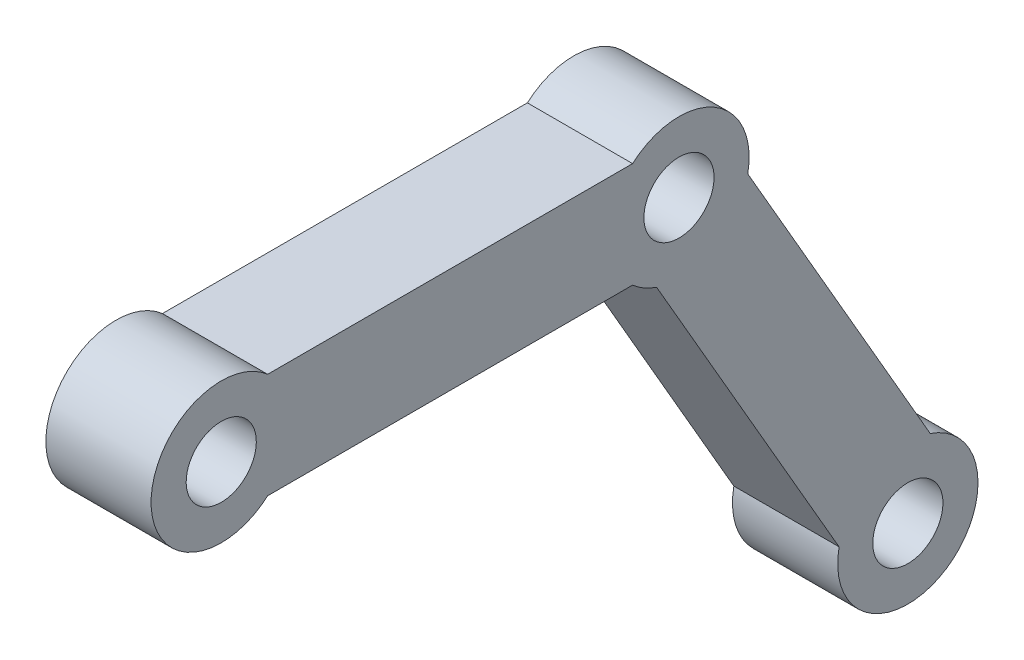
ISO-10303-21;
HEADER;
FILE_DESCRIPTION(('STEP AP214'),'2;1');
FILE_NAME('part.step','',(''),(''),'','','');
FILE_SCHEMA(('AUTOMOTIVE_DESIGN { 1 0 10303 214 1 1 1 1 }'));
ENDSEC;
DATA;
#1=APPLICATION_CONTEXT('core data for automotive mechanical design processes');
#2=APPLICATION_PROTOCOL_DEFINITION('international standard','automotive_design',2000,#1);
#3=PRODUCT_CONTEXT('',#1,'mechanical');
#4=PRODUCT('Part','Part','',(#3));
#5=PRODUCT_RELATED_PRODUCT_CATEGORY('part','',(#4));
#6=PRODUCT_DEFINITION_FORMATION('','',#4);
#7=PRODUCT_DEFINITION_CONTEXT('part definition',#1,'design');
#8=PRODUCT_DEFINITION('design','',#6,#7);
#9=PRODUCT_DEFINITION_SHAPE('','',#8);
#10=(LENGTH_UNIT() NAMED_UNIT(*) SI_UNIT(.MILLI.,.METRE.));
#11=(NAMED_UNIT(*) PLANE_ANGLE_UNIT() SI_UNIT($,.RADIAN.));
#12=(NAMED_UNIT(*) SI_UNIT($,.STERADIAN.) SOLID_ANGLE_UNIT());
#13=UNCERTAINTY_MEASURE_WITH_UNIT(LENGTH_MEASURE(1.E-05),#10,'distance_accuracy_value','');
#14=(GEOMETRIC_REPRESENTATION_CONTEXT(3) GLOBAL_UNCERTAINTY_ASSIGNED_CONTEXT((#13)) GLOBAL_UNIT_ASSIGNED_CONTEXT((#10,
#11,#12)) REPRESENTATION_CONTEXT('',''));
#15=CARTESIAN_POINT('',(0.,0.,0.));
#16=DIRECTION('',(0.,0.,1.));
#17=DIRECTION('',(1.,0.,0.));
#18=AXIS2_PLACEMENT_3D('',#15,#16,#17);
#19=CARTESIAN_POINT('',(-15.,0.836602540378303,17.803520777581));
#20=DIRECTION('',(0.,0.500000000000004,-0.866025403784436));
#21=DIRECTION('',(0.,0.866025403784436,0.500000000000004));
#22=AXIS2_PLACEMENT_3D('',#19,#20,#21);
#23=PLANE('',#22);
#24=DIRECTION('',(0.,-0.866025403784436,-0.500000000000004));
#25=VECTOR('',#24,1.);
#26=CARTESIAN_POINT('',(-15.,0.836602540378303,17.803520777581));
#27=LINE('',#26,#25);
#28=CARTESIAN_POINT('',(-15.,-18.9564392373896,6.37600277910501));
#29=VERTEX_POINT('',#28);
#30=CARTESIAN_POINT('',(-15.,-109.059875956479,-45.6452406655725));
#31=VERTEX_POINT('',#30);
#32=EDGE_CURVE('E227',#29,#31,#27,.T.);
#33=ORIENTED_EDGE('',*,*,#32,.T.);
#34=DIRECTION('',(1.,0.,0.));
#35=VECTOR('',#34,1.);
#36=CARTESIAN_POINT('',(-15.,-109.059875956479,-45.6452406655725));
#37=LINE('',#36,#35);
#38=CARTESIAN_POINT('',(15.,-109.059875956479,-45.6452406655725));
#39=VERTEX_POINT('',#38);
#40=EDGE_CURVE('E313',#31,#39,#37,.T.);
#41=ORIENTED_EDGE('',*,*,#40,.T.);
#42=DIRECTION('',(0.,-0.866025403784436,-0.500000000000004));
#43=VECTOR('',#42,1.);
#44=CARTESIAN_POINT('',(15.,0.836602540378303,17.803520777581));
#45=LINE('',#44,#43);
#46=CARTESIAN_POINT('',(15.,-18.9564392373896,6.37600277910501));
#47=VERTEX_POINT('',#46);
#48=EDGE_CURVE('E223',#47,#39,#45,.T.);
#49=ORIENTED_EDGE('',*,*,#48,.F.);
#50=DIRECTION('',(1.,0.,0.));
#51=VECTOR('',#50,1.);
#52=CARTESIAN_POINT('',(-15.,-18.9564392373896,6.37600277910501));
#53=LINE('',#52,#51);
#54=EDGE_CURVE('E187',#47,#29,#53,.F.);
#55=ORIENTED_EDGE('',*,*,#54,.T.);
#56=EDGE_LOOP('',(#33,#41,#49,#55));
#57=FACE_BOUND('',#56,.T.);
#58=ADVANCED_FACE('F40',(#57),#23,.F.);
#59=CARTESIAN_POINT('',(-15.,15.8366025403784,-8.17724133595211));
#60=DIRECTION('',(0.,-0.500000000000004,0.866025403784436));
#61=DIRECTION('',(0.,-0.866025403784436,-0.500000000000004));
#62=AXIS2_PLACEMENT_3D('',#59,#60,#61);
#63=PLANE('',#62);
#64=DIRECTION('',(0.,-0.866025403784436,-0.500000000000004));
#65=VECTOR('',#64,1.);
#66=CARTESIAN_POINT('',(15.,15.8366025403784,-8.17724133595211));
#67=LINE('',#66,#65);
#68=CARTESIAN_POINT('',(15.,-3.95643923738951,-19.6047593344281));
#69=VERTEX_POINT('',#68);
#70=CARTESIAN_POINT('',(15.,-94.0598759564793,-71.6260027791056));
#71=VERTEX_POINT('',#70);
#72=EDGE_CURVE('E219',#69,#71,#67,.T.);
#73=ORIENTED_EDGE('',*,*,#72,.T.);
#74=DIRECTION('',(1.,0.,0.));
#75=VECTOR('',#74,1.);
#76=CARTESIAN_POINT('',(-15.,-94.0598759564793,-71.6260027791056));
#77=LINE('',#76,#75);
#78=CARTESIAN_POINT('',(-15.,-94.0598759564793,-71.6260027791056));
#79=VERTEX_POINT('',#78);
#80=EDGE_CURVE('E310',#71,#79,#77,.F.);
#81=ORIENTED_EDGE('',*,*,#80,.T.);
#82=DIRECTION('',(0.,-0.866025403784436,-0.500000000000004));
#83=VECTOR('',#82,1.);
#84=CARTESIAN_POINT('',(-15.,15.8366025403784,-8.17724133595211));
#85=LINE('',#84,#83);
#86=CARTESIAN_POINT('',(-15.,-3.95643923738951,-19.6047593344281));
#87=VERTEX_POINT('',#86);
#88=EDGE_CURVE('E214',#87,#79,#85,.T.);
#89=ORIENTED_EDGE('',*,*,#88,.F.);
#90=DIRECTION('',(1.,0.,0.));
#91=VECTOR('',#90,1.);
#92=CARTESIAN_POINT('',(-15.,-3.9564392373895,-19.6047593344281));
#93=LINE('',#92,#91);
#94=EDGE_CURVE('E267',#87,#69,#93,.T.);
#95=ORIENTED_EDGE('',*,*,#94,.T.);
#96=EDGE_LOOP('',(#73,#81,#89,#95));
#97=FACE_BOUND('',#96,.T.);
#98=ADVANCED_FACE('F42',(#97),#63,.F.);
#99=CARTESIAN_POINT('',(-15.,15.,130.5));
#100=DIRECTION('',(0.,-1.,0.));
#101=DIRECTION('',(0.,0.,-1.));
#102=AXIS2_PLACEMENT_3D('',#99,#100,#101);
#103=PLANE('',#102);
#104=DIRECTION('',(0.,0.,-1.));
#105=VECTOR('',#104,1.);
#106=CARTESIAN_POINT('',(-15.,15.,130.5));
#107=LINE('',#106,#105);
#108=CARTESIAN_POINT('',(-15.,15.,117.271243444677));
#109=VERTEX_POINT('',#108);
#110=CARTESIAN_POINT('',(-15.,15.,13.228756555323));
#111=VERTEX_POINT('',#110);
#112=EDGE_CURVE('E211',#109,#111,#107,.T.);
#113=ORIENTED_EDGE('',*,*,#112,.F.);
#114=DIRECTION('',(1.,0.,0.));
#115=VECTOR('',#114,1.);
#116=CARTESIAN_POINT('',(-15.,15.,117.271243444677));
#117=LINE('',#116,#115);
#118=CARTESIAN_POINT('',(15.,15.,117.271243444677));
#119=VERTEX_POINT('',#118);
#120=EDGE_CURVE('E57',#109,#119,#117,.T.);
#121=ORIENTED_EDGE('',*,*,#120,.T.);
#122=DIRECTION('',(0.,0.,-1.));
#123=VECTOR('',#122,1.);
#124=CARTESIAN_POINT('',(15.,15.,130.5));
#125=LINE('',#124,#123);
#126=CARTESIAN_POINT('',(15.,15.,13.228756555323));
#127=VERTEX_POINT('',#126);
#128=EDGE_CURVE('E197',#119,#127,#125,.T.);
#129=ORIENTED_EDGE('',*,*,#128,.T.);
#130=DIRECTION('',(1.,0.,0.));
#131=VECTOR('',#130,1.);
#132=CARTESIAN_POINT('',(-15.,15.,13.228756555323));
#133=LINE('',#132,#131);
#134=EDGE_CURVE('E259',#127,#111,#133,.F.);
#135=ORIENTED_EDGE('',*,*,#134,.T.);
#136=EDGE_LOOP('',(#113,#121,#129,#135));
#137=FACE_BOUND('',#136,.T.);
#138=ADVANCED_FACE('F394',(#137),#103,.F.);
#139=CARTESIAN_POINT('',(15.,15.,130.5));
#140=DIRECTION('',(-1.,0.,0.));
#141=DIRECTION('',(0.,-1.,0.));
#142=AXIS2_PLACEMENT_3D('',#139,#140,#141);
#143=PLANE('',#142);
#144=CARTESIAN_POINT('',(15.,0.,130.5));
#145=DIRECTION('',(1.,0.,0.));
#146=DIRECTION('',(0.,1.,0.));
#147=AXIS2_PLACEMENT_3D('',#144,#145,#146);
#148=CIRCLE('',#147,9.99999999999999);
#149=CARTESIAN_POINT('',(15.,10.,130.5));
#150=VERTEX_POINT('',#149);
#151=EDGE_CURVE('E418',#150,#150,#148,.T.);
#152=ORIENTED_EDGE('',*,*,#151,.F.);
#153=EDGE_LOOP('',(#152));
#154=FACE_BOUND('',#153,.T.);
#155=CARTESIAN_POINT('',(15.,0.,0.));
#156=DIRECTION('',(1.,0.,0.));
#157=DIRECTION('',(0.,1.,0.));
#158=AXIS2_PLACEMENT_3D('',#155,#156,#157);
#159=CIRCLE('',#158,10.);
#160=CARTESIAN_POINT('',(15.,10.,0.));
#161=VERTEX_POINT('',#160);
#162=EDGE_CURVE('E631',#161,#161,#159,.T.);
#163=ORIENTED_EDGE('',*,*,#162,.F.);
#164=EDGE_LOOP('',(#163));
#165=FACE_BOUND('',#164,.T.);
#166=CARTESIAN_POINT('',(15.,-113.016315193869,-65.2500000000006));
#167=DIRECTION('',(1.,0.,0.));
#168=DIRECTION('',(0.,1.,0.));
#169=AXIS2_PLACEMENT_3D('',#166,#167,#168);
#170=CIRCLE('',#169,9.99999999999999);
#171=CARTESIAN_POINT('',(15.,-103.016315193869,-65.2500000000006));
#172=VERTEX_POINT('',#171);
#173=EDGE_CURVE('E640',#172,#172,#170,.T.);
#174=ORIENTED_EDGE('',*,*,#173,.F.);
#175=EDGE_LOOP('',(#174));
#176=FACE_BOUND('',#175,.T.);
#177=ORIENTED_EDGE('',*,*,#128,.F.);
#178=CARTESIAN_POINT('',(15.,0.,130.5));
#179=DIRECTION('',(1.,0.,0.));
#180=DIRECTION('',(0.,1.,0.));
#181=AXIS2_PLACEMENT_3D('',#178,#179,#180);
#182=CIRCLE('',#181,20.);
#183=CARTESIAN_POINT('',(15.,-15.,117.271243444677));
#184=VERTEX_POINT('',#183);
#185=EDGE_CURVE('E408',#119,#184,#182,.T.);
#186=ORIENTED_EDGE('',*,*,#185,.T.);
#187=DIRECTION('',(0.,0.,-1.));
#188=VECTOR('',#187,1.);
#189=CARTESIAN_POINT('',(15.,-15.,130.5));
#190=LINE('',#189,#188);
#191=CARTESIAN_POINT('',(15.,-15.,13.2287565553229));
#192=VERTEX_POINT('',#191);
#193=EDGE_CURVE('E65',#184,#192,#190,.T.);
#194=ORIENTED_EDGE('',*,*,#193,.T.);
#195=CARTESIAN_POINT('',(15.,0.,0.));
#196=DIRECTION('',(1.,0.,0.));
#197=DIRECTION('',(0.,1.,0.));
#198=AXIS2_PLACEMENT_3D('',#195,#196,#197);
#199=CIRCLE('',#198,20.);
#200=EDGE_CURVE('E321',#192,#47,#199,.T.);
#201=ORIENTED_EDGE('',*,*,#200,.T.);
#202=ORIENTED_EDGE('',*,*,#48,.T.);
#203=CARTESIAN_POINT('',(15.,-113.016315193869,-65.2500000000006));
#204=DIRECTION('',(1.,0.,0.));
#205=DIRECTION('',(0.,1.,0.));
#206=AXIS2_PLACEMENT_3D('',#203,#204,#205);
#207=CIRCLE('',#206,20.);
#208=EDGE_CURVE('E294',#39,#71,#207,.T.);
#209=ORIENTED_EDGE('',*,*,#208,.T.);
#210=ORIENTED_EDGE('',*,*,#72,.F.);
#211=EDGE_CURVE('E316',#69,#127,#199,.T.);
#212=ORIENTED_EDGE('',*,*,#211,.T.);
#213=EDGE_LOOP('',(#177,#186,#194,#201,#202,#209,#210,#212));
#214=FACE_BOUND('',#213,.T.);
#215=ADVANCED_FACE('F386',(#154,#165,#176,#214),#143,.F.);
#216=CARTESIAN_POINT('',(-15.,-15.,130.5));
#217=DIRECTION('',(0.,1.,0.));
#218=DIRECTION('',(0.,0.,1.));
#219=AXIS2_PLACEMENT_3D('',#216,#217,#218);
#220=PLANE('',#219);
#221=ORIENTED_EDGE('',*,*,#193,.F.);
#222=DIRECTION('',(1.,0.,0.));
#223=VECTOR('',#222,1.);
#224=CARTESIAN_POINT('',(-15.,-15.,117.271243444677));
#225=LINE('',#224,#223);
#226=CARTESIAN_POINT('',(-15.,-15.,117.271243444677));
#227=VERTEX_POINT('',#226);
#228=EDGE_CURVE('E411',#184,#227,#225,.F.);
#229=ORIENTED_EDGE('',*,*,#228,.T.);
#230=DIRECTION('',(0.,0.,-1.));
#231=VECTOR('',#230,1.);
#232=CARTESIAN_POINT('',(-15.,-15.,130.5));
#233=LINE('',#232,#231);
#234=CARTESIAN_POINT('',(-15.,-15.,13.228756555323));
#235=VERTEX_POINT('',#234);
#236=EDGE_CURVE('E208',#227,#235,#233,.T.);
#237=ORIENTED_EDGE('',*,*,#236,.T.);
#238=DIRECTION('',(1.,0.,0.));
#239=VECTOR('',#238,1.);
#240=CARTESIAN_POINT('',(-15.,-15.,13.228756555323));
#241=LINE('',#240,#239);
#242=EDGE_CURVE('E254',#235,#192,#241,.T.);
#243=ORIENTED_EDGE('',*,*,#242,.T.);
#244=EDGE_LOOP('',(#221,#229,#237,#243));
#245=FACE_BOUND('',#244,.T.);
#246=ADVANCED_FACE('F380',(#245),#220,.F.);
#247=CARTESIAN_POINT('',(-15.,15.,130.5));
#248=DIRECTION('',(1.,0.,0.));
#249=DIRECTION('',(0.,1.,0.));
#250=AXIS2_PLACEMENT_3D('',#247,#248,#249);
#251=PLANE('',#250);
#252=CARTESIAN_POINT('',(-15.,0.,130.5));
#253=DIRECTION('',(1.,0.,0.));
#254=DIRECTION('',(0.,1.,0.));
#255=AXIS2_PLACEMENT_3D('',#252,#253,#254);
#256=CIRCLE('',#255,9.99999999999999);
#257=CARTESIAN_POINT('',(-15.,9.99999999999999,130.5));
#258=VERTEX_POINT('',#257);
#259=EDGE_CURVE('E413',#258,#258,#256,.T.);
#260=ORIENTED_EDGE('',*,*,#259,.T.);
#261=EDGE_LOOP('',(#260));
#262=FACE_BOUND('',#261,.T.);
#263=CARTESIAN_POINT('',(-15.,0.,0.));
#264=DIRECTION('',(1.,0.,0.));
#265=DIRECTION('',(0.,1.,0.));
#266=AXIS2_PLACEMENT_3D('',#263,#264,#265);
#267=CIRCLE('',#266,10.);
#268=CARTESIAN_POINT('',(-15.,10.,0.));
#269=VERTEX_POINT('',#268);
#270=EDGE_CURVE('E627',#269,#269,#267,.T.);
#271=ORIENTED_EDGE('',*,*,#270,.T.);
#272=EDGE_LOOP('',(#271));
#273=FACE_BOUND('',#272,.T.);
#274=CARTESIAN_POINT('',(-15.,-113.016315193869,-65.2500000000006));
#275=DIRECTION('',(1.,0.,0.));
#276=DIRECTION('',(0.,1.,0.));
#277=AXIS2_PLACEMENT_3D('',#274,#275,#276);
#278=CIRCLE('',#277,9.99999999999999);
#279=CARTESIAN_POINT('',(-15.,-103.016315193869,-65.2500000000006));
#280=VERTEX_POINT('',#279);
#281=EDGE_CURVE('E637',#280,#280,#278,.T.);
#282=ORIENTED_EDGE('',*,*,#281,.T.);
#283=EDGE_LOOP('',(#282));
#284=FACE_BOUND('',#283,.T.);
#285=CARTESIAN_POINT('',(-15.,0.,130.5));
#286=DIRECTION('',(1.,0.,0.));
#287=DIRECTION('',(0.,1.,0.));
#288=AXIS2_PLACEMENT_3D('',#285,#286,#287);
#289=CIRCLE('',#288,20.);
#290=EDGE_CURVE('E171',#109,#227,#289,.T.);
#291=ORIENTED_EDGE('',*,*,#290,.F.);
#292=ORIENTED_EDGE('',*,*,#112,.T.);
#293=CARTESIAN_POINT('',(-15.,0.,0.));
#294=DIRECTION('',(1.,0.,0.));
#295=DIRECTION('',(0.,1.,0.));
#296=AXIS2_PLACEMENT_3D('',#293,#294,#295);
#297=CIRCLE('',#296,20.);
#298=EDGE_CURVE('E317',#87,#111,#297,.T.);
#299=ORIENTED_EDGE('',*,*,#298,.F.);
#300=ORIENTED_EDGE('',*,*,#88,.T.);
#301=CARTESIAN_POINT('',(-15.,-113.016315193869,-65.2500000000006));
#302=DIRECTION('',(1.,0.,0.));
#303=DIRECTION('',(0.,1.,0.));
#304=AXIS2_PLACEMENT_3D('',#301,#302,#303);
#305=CIRCLE('',#304,20.);
#306=EDGE_CURVE('E288',#31,#79,#305,.T.);
#307=ORIENTED_EDGE('',*,*,#306,.F.);
#308=ORIENTED_EDGE('',*,*,#32,.F.);
#309=EDGE_CURVE('E287',#235,#29,#297,.T.);
#310=ORIENTED_EDGE('',*,*,#309,.F.);
#311=ORIENTED_EDGE('',*,*,#236,.F.);
#312=EDGE_LOOP('',(#291,#292,#299,#300,#307,#308,#310,#311));
#313=FACE_BOUND('',#312,.T.);
#314=ADVANCED_FACE('F285',(#262,#273,#284,#313),#251,.F.);
#315=CARTESIAN_POINT('',(-15.,0.,0.));
#316=DIRECTION('',(1.,0.,0.));
#317=DIRECTION('',(0.,1.,0.));
#318=AXIS2_PLACEMENT_3D('',#315,#316,#317);
#319=CYLINDRICAL_SURFACE('',#318,20.);
#320=ORIENTED_EDGE('',*,*,#54,.F.);
#321=ORIENTED_EDGE('',*,*,#200,.F.);
#322=ORIENTED_EDGE('',*,*,#242,.F.);
#323=ORIENTED_EDGE('',*,*,#309,.T.);
#324=EDGE_LOOP('',(#320,#321,#322,#323));
#325=FACE_BOUND('',#324,.T.);
#326=ADVANCED_FACE('F369',(#325),#319,.T.);
#327=ORIENTED_EDGE('',*,*,#94,.F.);
#328=ORIENTED_EDGE('',*,*,#298,.T.);
#329=ORIENTED_EDGE('',*,*,#134,.F.);
#330=ORIENTED_EDGE('',*,*,#211,.F.);
#331=EDGE_LOOP('',(#327,#328,#329,#330));
#332=FACE_BOUND('',#331,.T.);
#333=ADVANCED_FACE('F360',(#332),#319,.T.);
#334=CARTESIAN_POINT('',(-15.,-113.016315193869,-65.2500000000006));
#335=DIRECTION('',(1.,0.,0.));
#336=DIRECTION('',(0.,1.,0.));
#337=AXIS2_PLACEMENT_3D('',#334,#335,#336);
#338=CYLINDRICAL_SURFACE('',#337,20.);
#339=ORIENTED_EDGE('',*,*,#40,.F.);
#340=ORIENTED_EDGE('',*,*,#306,.T.);
#341=ORIENTED_EDGE('',*,*,#80,.F.);
#342=ORIENTED_EDGE('',*,*,#208,.F.);
#343=EDGE_LOOP('',(#339,#340,#341,#342));
#344=FACE_BOUND('',#343,.T.);
#345=ADVANCED_FACE('F349',(#344),#338,.T.);
#346=CARTESIAN_POINT('',(-15.,0.,130.5));
#347=DIRECTION('',(1.,0.,0.));
#348=DIRECTION('',(0.,1.,0.));
#349=AXIS2_PLACEMENT_3D('',#346,#347,#348);
#350=CYLINDRICAL_SURFACE('',#349,20.);
#351=ORIENTED_EDGE('',*,*,#120,.F.);
#352=ORIENTED_EDGE('',*,*,#290,.T.);
#353=ORIENTED_EDGE('',*,*,#228,.F.);
#354=ORIENTED_EDGE('',*,*,#185,.F.);
#355=EDGE_LOOP('',(#351,#352,#353,#354));
#356=FACE_BOUND('',#355,.T.);
#357=ADVANCED_FACE('F359',(#356),#350,.T.);
#358=CARTESIAN_POINT('',(-15.,-113.016315193869,-65.2500000000006));
#359=DIRECTION('',(1.,0.,0.));
#360=DIRECTION('',(0.,1.,0.));
#361=AXIS2_PLACEMENT_3D('',#358,#359,#360);
#362=CYLINDRICAL_SURFACE('',#361,9.99999999999999);
#363=ORIENTED_EDGE('',*,*,#281,.F.);
#364=EDGE_LOOP('',(#363));
#365=FACE_BOUND('',#364,.T.);
#366=ORIENTED_EDGE('',*,*,#173,.T.);
#367=EDGE_LOOP('',(#366));
#368=FACE_BOUND('',#367,.T.);
#369=ADVANCED_FACE('F486',(#365,#368),#362,.F.);
#370=CARTESIAN_POINT('',(-15.,0.,0.));
#371=DIRECTION('',(1.,0.,0.));
#372=DIRECTION('',(0.,1.,0.));
#373=AXIS2_PLACEMENT_3D('',#370,#371,#372);
#374=CYLINDRICAL_SURFACE('',#373,10.);
#375=ORIENTED_EDGE('',*,*,#270,.F.);
#376=EDGE_LOOP('',(#375));
#377=FACE_BOUND('',#376,.T.);
#378=ORIENTED_EDGE('',*,*,#162,.T.);
#379=EDGE_LOOP('',(#378));
#380=FACE_BOUND('',#379,.T.);
#381=ADVANCED_FACE('F490',(#377,#380),#374,.F.);
#382=CARTESIAN_POINT('',(-15.,0.,130.5));
#383=DIRECTION('',(1.,0.,0.));
#384=DIRECTION('',(0.,1.,0.));
#385=AXIS2_PLACEMENT_3D('',#382,#383,#384);
#386=CYLINDRICAL_SURFACE('',#385,9.99999999999999);
#387=ORIENTED_EDGE('',*,*,#259,.F.);
#388=EDGE_LOOP('',(#387));
#389=FACE_BOUND('',#388,.T.);
#390=ORIENTED_EDGE('',*,*,#151,.T.);
#391=EDGE_LOOP('',(#390));
#392=FACE_BOUND('',#391,.T.);
#393=ADVANCED_FACE('F501',(#389,#392),#386,.F.);
#394=CLOSED_SHELL('',(#58,#98,#138,#215,#246,#314,#326,#333,#345,#357,#369,#381,#393));
#395=DIRECTION('',(1.,0.,0.));
#396=VECTOR('',#395,1.);
#397=CARTESIAN_POINT('',(-15.,12.5,15.612494995996));
#398=LINE('',#397,#396);
#399=CARTESIAN_POINT('',(-12.5,12.5,15.612494995996));
#400=VERTEX_POINT('',#399);
#401=CARTESIAN_POINT('',(12.5,12.5,15.612494995996));
#402=VERTEX_POINT('',#401);
#403=EDGE_CURVE('E332',#400,#402,#398,.T.);
#404=ORIENTED_EDGE('',*,*,#403,.F.);
#405=CARTESIAN_POINT('',(-12.5,0.,0.));
#406=DIRECTION('',(-1.,0.,0.));
#407=DIRECTION('',(0.,-1.,0.));
#408=AXIS2_PLACEMENT_3D('',#405,#406,#407);
#409=CIRCLE('',#408,20.);
#410=CARTESIAN_POINT('',(-12.5,-12.5,15.612494995996));
#411=VERTEX_POINT('',#410);
#412=EDGE_CURVE('E328',#411,#400,#409,.T.);
#413=ORIENTED_EDGE('',*,*,#412,.F.);
#414=DIRECTION('',(1.,0.,0.));
#415=VECTOR('',#414,1.);
#416=CARTESIAN_POINT('',(-15.,-12.5,15.612494995996));
#417=LINE('',#416,#415);
#418=CARTESIAN_POINT('',(12.5,-12.5,15.612494995996));
#419=VERTEX_POINT('',#418);
#420=EDGE_CURVE('E325',#419,#411,#417,.F.);
#421=ORIENTED_EDGE('',*,*,#420,.F.);
#422=CARTESIAN_POINT('',(12.5,0.,0.));
#423=DIRECTION('',(1.,0.,0.));
#424=DIRECTION('',(0.,1.,0.));
#425=AXIS2_PLACEMENT_3D('',#422,#423,#424);
#426=CIRCLE('',#425,20.);
#427=EDGE_CURVE('E176',#402,#419,#426,.T.);
#428=ORIENTED_EDGE('',*,*,#427,.F.);
#429=EDGE_LOOP('',(#404,#413,#421,#428));
#430=FACE_BOUND('',#429,.T.);
#431=ADVANCED_FACE('F363',(#430),#319,.T.);
#432=CARTESIAN_POINT('',(12.5,12.5,130.5));
#433=DIRECTION('',(1.,0.,0.));
#434=DIRECTION('',(0.,1.,0.));
#435=AXIS2_PLACEMENT_3D('',#432,#433,#434);
#436=PLANE('',#435);
#437=DIRECTION('',(0.,0.,-1.));
#438=VECTOR('',#437,1.);
#439=CARTESIAN_POINT('',(12.5,-12.5,130.5));
#440=LINE('',#439,#438);
#441=CARTESIAN_POINT('',(12.5,-12.5,114.887505004004));
#442=VERTEX_POINT('',#441);
#443=EDGE_CURVE('E166',#442,#419,#440,.T.);
#444=ORIENTED_EDGE('',*,*,#443,.F.);
#445=CARTESIAN_POINT('',(12.5,0.,130.5));
#446=DIRECTION('',(1.,0.,0.));
#447=DIRECTION('',(0.,1.,0.));
#448=AXIS2_PLACEMENT_3D('',#445,#446,#447);
#449=CIRCLE('',#448,20.);
#450=CARTESIAN_POINT('',(12.5,12.5,114.887505004004));
#451=VERTEX_POINT('',#450);
#452=EDGE_CURVE('E11',#442,#451,#449,.T.);
#453=ORIENTED_EDGE('',*,*,#452,.T.);
#454=DIRECTION('',(0.,0.,-1.));
#455=VECTOR('',#454,1.);
#456=CARTESIAN_POINT('',(12.5,12.5,130.5));
#457=LINE('',#456,#455);
#458=EDGE_CURVE('E178',#451,#402,#457,.T.);
#459=ORIENTED_EDGE('',*,*,#458,.T.);
#460=ORIENTED_EDGE('',*,*,#427,.T.);
#461=EDGE_LOOP('',(#444,#453,#459,#460));
#462=FACE_BOUND('',#461,.T.);
#463=ADVANCED_FACE('F174',(#462),#436,.F.);
#464=CARTESIAN_POINT('',(-12.5,-12.5,130.5));
#465=DIRECTION('',(0.,-1.,0.));
#466=DIRECTION('',(1.,0.,0.));
#467=AXIS2_PLACEMENT_3D('',#464,#465,#466);
#468=PLANE('',#467);
#469=DIRECTION('',(0.,0.,-1.));
#470=VECTOR('',#469,1.);
#471=CARTESIAN_POINT('',(-12.5,-12.5,130.5));
#472=LINE('',#471,#470);
#473=CARTESIAN_POINT('',(-12.5,-12.5,114.887505004004));
#474=VERTEX_POINT('',#473);
#475=EDGE_CURVE('E168',#474,#411,#472,.T.);
#476=ORIENTED_EDGE('',*,*,#475,.F.);
#477=DIRECTION('',(1.,0.,0.));
#478=VECTOR('',#477,1.);
#479=CARTESIAN_POINT('',(-15.,-12.5,114.887505004004));
#480=LINE('',#479,#478);
#481=EDGE_CURVE('E155',#474,#442,#480,.T.);
#482=ORIENTED_EDGE('',*,*,#481,.T.);
#483=ORIENTED_EDGE('',*,*,#443,.T.);
#484=ORIENTED_EDGE('',*,*,#420,.T.);
#485=EDGE_LOOP('',(#476,#482,#483,#484));
#486=FACE_BOUND('',#485,.T.);
#487=ADVANCED_FACE('F164',(#486),#468,.F.);
#488=CARTESIAN_POINT('',(-12.5,12.5,130.5));
#489=DIRECTION('',(-1.,0.,0.));
#490=DIRECTION('',(0.,-1.,0.));
#491=AXIS2_PLACEMENT_3D('',#488,#489,#490);
#492=PLANE('',#491);
#493=DIRECTION('',(0.,0.,-1.));
#494=VECTOR('',#493,1.);
#495=CARTESIAN_POINT('',(-12.5,12.5,130.5));
#496=LINE('',#495,#494);
#497=CARTESIAN_POINT('',(-12.5,12.5,114.887505004004));
#498=VERTEX_POINT('',#497);
#499=EDGE_CURVE('E182',#498,#400,#496,.T.);
#500=ORIENTED_EDGE('',*,*,#499,.F.);
#501=CARTESIAN_POINT('',(-12.5,0.,130.5));
#502=DIRECTION('',(-1.,0.,0.));
#503=DIRECTION('',(0.,-1.,0.));
#504=AXIS2_PLACEMENT_3D('',#501,#502,#503);
#505=CIRCLE('',#504,20.);
#506=EDGE_CURVE('E170',#498,#474,#505,.T.);
#507=ORIENTED_EDGE('',*,*,#506,.T.);
#508=ORIENTED_EDGE('',*,*,#475,.T.);
#509=ORIENTED_EDGE('',*,*,#412,.T.);
#510=EDGE_LOOP('',(#500,#507,#508,#509));
#511=FACE_BOUND('',#510,.T.);
#512=ADVANCED_FACE('F435',(#511),#492,.F.);
#513=CARTESIAN_POINT('',(-12.5,12.5,130.5));
#514=DIRECTION('',(0.,1.,0.));
#515=DIRECTION('',(0.,0.,1.));
#516=AXIS2_PLACEMENT_3D('',#513,#514,#515);
#517=PLANE('',#516);
#518=ORIENTED_EDGE('',*,*,#458,.F.);
#519=DIRECTION('',(1.,0.,0.));
#520=VECTOR('',#519,1.);
#521=CARTESIAN_POINT('',(-15.,12.5,114.887505004004));
#522=LINE('',#521,#520);
#523=EDGE_CURVE('E158',#451,#498,#522,.F.);
#524=ORIENTED_EDGE('',*,*,#523,.T.);
#525=ORIENTED_EDGE('',*,*,#499,.T.);
#526=ORIENTED_EDGE('',*,*,#403,.T.);
#527=EDGE_LOOP('',(#518,#524,#525,#526));
#528=FACE_BOUND('',#527,.T.);
#529=ADVANCED_FACE('F432',(#528),#517,.F.);
#530=ORIENTED_EDGE('',*,*,#523,.F.);
#531=ORIENTED_EDGE('',*,*,#452,.F.);
#532=ORIENTED_EDGE('',*,*,#481,.F.);
#533=ORIENTED_EDGE('',*,*,#506,.F.);
#534=EDGE_LOOP('',(#530,#531,#532,#533));
#535=FACE_BOUND('',#534,.T.);
#536=ADVANCED_FACE('F154',(#535),#350,.T.);
#537=CLOSED_SHELL('',(#431,#463,#487,#512,#529,#536));
#538=CARTESIAN_POINT('',(12.5,0.,0.));
#539=DIRECTION('',(1.,0.,0.));
#540=DIRECTION('',(0.,0.,-1.));
#541=AXIS2_PLACEMENT_3D('',#538,#539,#540);
#542=CIRCLE('',#541,20.);
#543=CARTESIAN_POINT('',(12.5,-19.77081728299,3.01907004930739));
#544=VERTEX_POINT('',#543);
#545=CARTESIAN_POINT('',(12.5,-7.27081728298987,-18.6315650453035));
#546=VERTEX_POINT('',#545);
#547=EDGE_CURVE('E250',#544,#546,#542,.T.);
#548=ORIENTED_EDGE('',*,*,#547,.F.);
#549=DIRECTION('',(1.,0.,0.));
#550=VECTOR('',#549,1.);
#551=CARTESIAN_POINT('',(-15.,-19.77081728299,3.01907004930739));
#552=LINE('',#551,#550);
#553=CARTESIAN_POINT('',(-12.5,-19.77081728299,3.01907004930739));
#554=VERTEX_POINT('',#553);
#555=EDGE_CURVE('E255',#554,#544,#552,.T.);
#556=ORIENTED_EDGE('',*,*,#555,.F.);
#557=CARTESIAN_POINT('',(-12.5,0.,0.));
#558=DIRECTION('',(-1.,0.,0.));
#559=DIRECTION('',(0.,0.,1.));
#560=AXIS2_PLACEMENT_3D('',#557,#558,#559);
#561=CIRCLE('',#560,20.);
#562=CARTESIAN_POINT('',(-12.5,-7.27081728298987,-18.6315650453035));
#563=VERTEX_POINT('',#562);
#564=EDGE_CURVE('E261',#563,#554,#561,.T.);
#565=ORIENTED_EDGE('',*,*,#564,.F.);
#566=DIRECTION('',(1.,0.,0.));
#567=VECTOR('',#566,1.);
#568=CARTESIAN_POINT('',(-15.,-7.27081728298987,-18.6315650453035));
#569=LINE('',#568,#567);
#570=EDGE_CURVE('E336',#546,#563,#569,.F.);
#571=ORIENTED_EDGE('',*,*,#570,.F.);
#572=EDGE_LOOP('',(#548,#556,#565,#571));
#573=FACE_BOUND('',#572,.T.);
#574=ADVANCED_FACE('F355',(#573),#319,.T.);
#575=CARTESIAN_POINT('',(-12.5,13.2116025403784,-6.80603444662676));
#576=DIRECTION('',(0.,0.500000000000004,-0.866025403784436));
#577=DIRECTION('',(0.,0.866025403784436,0.500000000000004));
#578=AXIS2_PLACEMENT_3D('',#575,#576,#577);
#579=PLANE('',#578);
#580=DIRECTION('',(0.,-0.866025403784436,-0.500000000000004));
#581=VECTOR('',#580,1.);
#582=CARTESIAN_POINT('',(-12.5,13.2116025403784,-6.80603444662676));
#583=LINE('',#582,#581);
#584=CARTESIAN_POINT('',(-12.5,-93.245497910879,-68.2690700493079));
#585=VERTEX_POINT('',#584);
#586=EDGE_CURVE('E192',#563,#585,#583,.T.);
#587=ORIENTED_EDGE('',*,*,#586,.T.);
#588=DIRECTION('',(1.,0.,0.));
#589=VECTOR('',#588,1.);
#590=CARTESIAN_POINT('',(-15.,-93.245497910879,-68.2690700493079));
#591=LINE('',#590,#589);
#592=CARTESIAN_POINT('',(12.5,-93.245497910879,-68.269070049308));
#593=VERTEX_POINT('',#592);
#594=EDGE_CURVE('E50',#585,#593,#591,.T.);
#595=ORIENTED_EDGE('',*,*,#594,.T.);
#596=DIRECTION('',(0.,-0.866025403784436,-0.500000000000004));
#597=VECTOR('',#596,1.);
#598=CARTESIAN_POINT('',(12.5,13.2116025403784,-6.80603444662676));
#599=LINE('',#598,#597);
#600=EDGE_CURVE('E184',#546,#593,#599,.T.);
#601=ORIENTED_EDGE('',*,*,#600,.F.);
#602=ORIENTED_EDGE('',*,*,#570,.T.);
#603=EDGE_LOOP('',(#587,#595,#601,#602));
#604=FACE_BOUND('',#603,.T.);
#605=ADVANCED_FACE('F239',(#604),#579,.F.);
#606=CARTESIAN_POINT('',(-12.5,13.2116025403784,-6.80603444662676));
#607=DIRECTION('',(-1.,0.,0.));
#608=DIRECTION('',(0.,0.,1.));
#609=AXIS2_PLACEMENT_3D('',#606,#607,#608);
#610=PLANE('',#609);
#611=DIRECTION('',(0.,-0.866025403784436,-0.500000000000004));
#612=VECTOR('',#611,1.);
#613=CARTESIAN_POINT('',(-12.5,0.711602540378331,14.8446006479841));
#614=LINE('',#613,#612);
#615=CARTESIAN_POINT('',(-12.5,-105.745497910879,-46.6184349546971));
#616=VERTEX_POINT('',#615);
#617=EDGE_CURVE('E196',#554,#616,#614,.T.);
#618=ORIENTED_EDGE('',*,*,#617,.T.);
#619=CARTESIAN_POINT('',(-12.5,-113.016315193869,-65.2500000000006));
#620=DIRECTION('',(-1.,0.,0.));
#621=DIRECTION('',(0.,0.,1.));
#622=AXIS2_PLACEMENT_3D('',#619,#620,#621);
#623=CIRCLE('',#622,20.);
#624=EDGE_CURVE('E293',#616,#585,#623,.T.);
#625=ORIENTED_EDGE('',*,*,#624,.T.);
#626=ORIENTED_EDGE('',*,*,#586,.F.);
#627=ORIENTED_EDGE('',*,*,#564,.T.);
#628=EDGE_LOOP('',(#618,#625,#626,#627));
#629=FACE_BOUND('',#628,.T.);
#630=ADVANCED_FACE('F342',(#629),#610,.F.);
#631=CARTESIAN_POINT('',(-12.5,0.711602540378331,14.8446006479841));
#632=DIRECTION('',(0.,-0.500000000000004,0.866025403784436));
#633=DIRECTION('',(0.,-0.866025403784436,-0.500000000000004));
#634=AXIS2_PLACEMENT_3D('',#631,#632,#633);
#635=PLANE('',#634);
#636=DIRECTION('',(0.,-0.866025403784436,-0.500000000000004));
#637=VECTOR('',#636,1.);
#638=CARTESIAN_POINT('',(12.5,0.711602540378331,14.8446006479841));
#639=LINE('',#638,#637);
#640=CARTESIAN_POINT('',(12.5,-105.745497910879,-46.6184349546971));
#641=VERTEX_POINT('',#640);
#642=EDGE_CURVE('E201',#544,#641,#639,.T.);
#643=ORIENTED_EDGE('',*,*,#642,.T.);
#644=DIRECTION('',(1.,0.,0.));
#645=VECTOR('',#644,1.);
#646=CARTESIAN_POINT('',(-15.,-105.745497910879,-46.6184349546971));
#647=LINE('',#646,#645);
#648=EDGE_CURVE('E298',#641,#616,#647,.F.);
#649=ORIENTED_EDGE('',*,*,#648,.T.);
#650=ORIENTED_EDGE('',*,*,#617,.F.);
#651=ORIENTED_EDGE('',*,*,#555,.T.);
#652=EDGE_LOOP('',(#643,#649,#650,#651));
#653=FACE_BOUND('',#652,.T.);
#654=ADVANCED_FACE('F344',(#653),#635,.F.);
#655=CARTESIAN_POINT('',(12.5,13.2116025403784,-6.80603444662676));
#656=DIRECTION('',(1.,0.,0.));
#657=DIRECTION('',(0.,0.,-1.));
#658=AXIS2_PLACEMENT_3D('',#655,#656,#657);
#659=PLANE('',#658);
#660=ORIENTED_EDGE('',*,*,#600,.T.);
#661=CARTESIAN_POINT('',(12.5,-113.016315193869,-65.2500000000006));
#662=DIRECTION('',(1.,0.,0.));
#663=DIRECTION('',(0.,0.,-1.));
#664=AXIS2_PLACEMENT_3D('',#661,#662,#663);
#665=CIRCLE('',#664,20.);
#666=EDGE_CURVE('E249',#593,#641,#665,.T.);
#667=ORIENTED_EDGE('',*,*,#666,.T.);
#668=ORIENTED_EDGE('',*,*,#642,.F.);
#669=ORIENTED_EDGE('',*,*,#547,.T.);
#670=EDGE_LOOP('',(#660,#667,#668,#669));
#671=FACE_BOUND('',#670,.T.);
#672=ADVANCED_FACE('F247',(#671),#659,.F.);
#673=ORIENTED_EDGE('',*,*,#666,.F.);
#674=ORIENTED_EDGE('',*,*,#594,.F.);
#675=ORIENTED_EDGE('',*,*,#624,.F.);
#676=ORIENTED_EDGE('',*,*,#648,.F.);
#677=EDGE_LOOP('',(#673,#674,#675,#676));
#678=FACE_BOUND('',#677,.T.);
#679=ADVANCED_FACE('F345',(#678),#338,.T.);
#680=CLOSED_SHELL('',(#574,#605,#630,#654,#672,#679));
#681=ORIENTED_CLOSED_SHELL('',*,#537,.T.);
#682=ORIENTED_CLOSED_SHELL('',*,#680,.T.);
#683=BREP_WITH_VOIDS('B2',#394,(#681,#682));
#684=ADVANCED_BREP_SHAPE_REPRESENTATION('',(#18,#683),#14);
#685=SHAPE_DEFINITION_REPRESENTATION(#9,#684);
ENDSEC;
END-ISO-10303-21;
